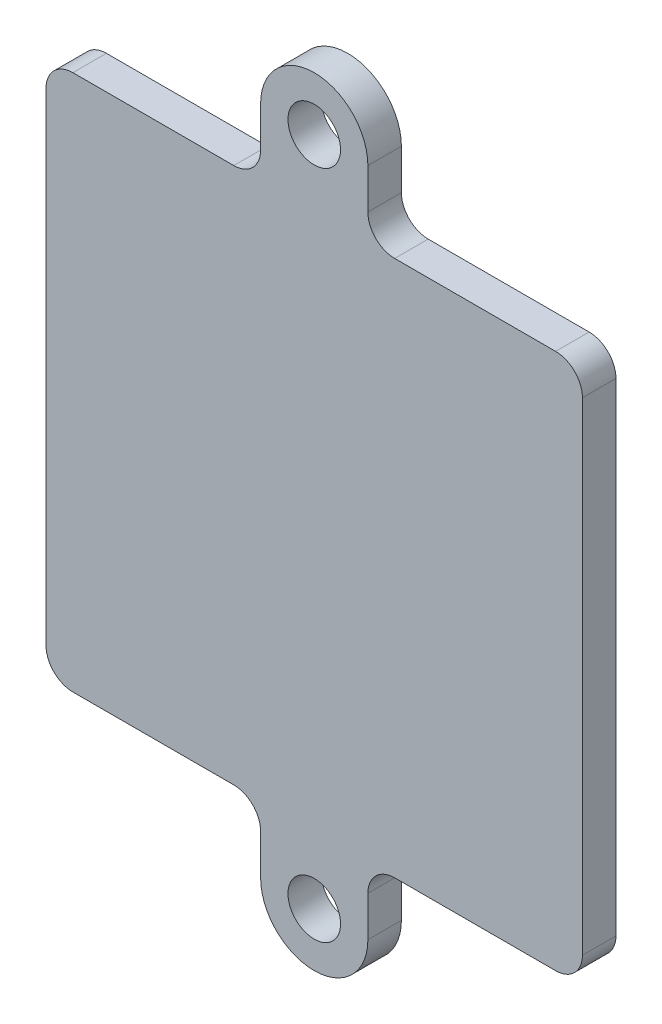
ISO-10303-21;
HEADER;
FILE_DESCRIPTION(('STEP AP214'),'2;1');
FILE_NAME('part.step','',(''),(''),'','','');
FILE_SCHEMA(('AUTOMOTIVE_DESIGN { 1 0 10303 214 1 1 1 1 }'));
ENDSEC;
DATA;
#1=APPLICATION_CONTEXT('core data for automotive mechanical design processes');
#2=APPLICATION_PROTOCOL_DEFINITION('international standard','automotive_design',2000,#1);
#3=PRODUCT_CONTEXT('',#1,'mechanical');
#4=PRODUCT('Part','Part','',(#3));
#5=PRODUCT_RELATED_PRODUCT_CATEGORY('part','',(#4));
#6=PRODUCT_DEFINITION_FORMATION('','',#4);
#7=PRODUCT_DEFINITION_CONTEXT('part definition',#1,'design');
#8=PRODUCT_DEFINITION('design','',#6,#7);
#9=PRODUCT_DEFINITION_SHAPE('','',#8);
#10=(LENGTH_UNIT() NAMED_UNIT(*) SI_UNIT(.MILLI.,.METRE.));
#11=(NAMED_UNIT(*) PLANE_ANGLE_UNIT() SI_UNIT($,.RADIAN.));
#12=(NAMED_UNIT(*) SI_UNIT($,.STERADIAN.) SOLID_ANGLE_UNIT());
#13=UNCERTAINTY_MEASURE_WITH_UNIT(LENGTH_MEASURE(1.E-05),#10,'distance_accuracy_value','');
#14=(GEOMETRIC_REPRESENTATION_CONTEXT(3) GLOBAL_UNCERTAINTY_ASSIGNED_CONTEXT((#13)) GLOBAL_UNIT_ASSIGNED_CONTEXT((#10,
#11,#12)) REPRESENTATION_CONTEXT('',''));
#15=CARTESIAN_POINT('',(0.,0.,0.));
#16=DIRECTION('',(0.,0.,1.));
#17=DIRECTION('',(1.,0.,0.));
#18=AXIS2_PLACEMENT_3D('',#15,#16,#17);
#19=CARTESIAN_POINT('',(-80.881847215181,46.1204293588608,3.175));
#20=DIRECTION('',(0.,0.,-1.));
#21=DIRECTION('',(-1.,0.,0.));
#22=AXIS2_PLACEMENT_3D('',#19,#20,#21);
#23=PLANE('',#22);
#24=DIRECTION('',(1.,0.,0.));
#25=VECTOR('',#24,1.);
#26=CARTESIAN_POINT('',(-55.481847215181,52.4704293588608,3.175));
#27=LINE('',#26,#25);
#28=CARTESIAN_POINT('',(-73.261847215181,52.4704293588608,3.175));
#29=VERTEX_POINT('',#28);
#30=CARTESIAN_POINT('',(-58.021847215181,52.4704293588608,3.175));
#31=VERTEX_POINT('',#30);
#32=EDGE_CURVE('E220',#29,#31,#27,.T.);
#33=ORIENTED_EDGE('',*,*,#32,.T.);
#34=CARTESIAN_POINT('',(-58.021847215181,55.0104293588608,3.175));
#35=DIRECTION('',(0.,0.,-1.));
#36=DIRECTION('',(-1.,0.,0.));
#37=AXIS2_PLACEMENT_3D('',#34,#35,#36);
#38=CIRCLE('',#37,2.54);
#39=CARTESIAN_POINT('',(-55.481847215181,55.0104293588608,3.175));
#40=VERTEX_POINT('',#39);
#41=EDGE_CURVE('E284',#31,#40,#38,.F.);
#42=ORIENTED_EDGE('',*,*,#41,.T.);
#43=DIRECTION('',(0.,1.,0.));
#44=VECTOR('',#43,1.);
#45=CARTESIAN_POINT('',(-55.481847215181,103.270429358861,3.175));
#46=LINE('',#45,#44);
#47=CARTESIAN_POINT('',(-55.481847215181,100.730429358861,3.175));
#48=VERTEX_POINT('',#47);
#49=EDGE_CURVE('E254',#40,#48,#46,.T.);
#50=ORIENTED_EDGE('',*,*,#49,.T.);
#51=CARTESIAN_POINT('',(-58.021847215181,100.730429358861,3.175));
#52=DIRECTION('',(0.,0.,-1.));
#53=DIRECTION('',(-1.,0.,0.));
#54=AXIS2_PLACEMENT_3D('',#51,#52,#53);
#55=CIRCLE('',#54,2.54);
#56=CARTESIAN_POINT('',(-58.021847215181,103.270429358861,3.175));
#57=VERTEX_POINT('',#56);
#58=EDGE_CURVE('E278',#48,#57,#55,.F.);
#59=ORIENTED_EDGE('',*,*,#58,.T.);
#60=DIRECTION('',(-1.,0.,0.));
#61=VECTOR('',#60,1.);
#62=CARTESIAN_POINT('',(-55.481847215181,103.270429358861,3.175));
#63=LINE('',#62,#61);
#64=CARTESIAN_POINT('',(-73.261847215181,103.270429358861,3.175));
#65=VERTEX_POINT('',#64);
#66=EDGE_CURVE('E186',#57,#65,#63,.T.);
#67=ORIENTED_EDGE('',*,*,#66,.T.);
#68=CARTESIAN_POINT('',(-73.261847215181,105.810429358861,3.175));
#69=DIRECTION('',(0.,0.,-1.));
#70=DIRECTION('',(-1.,0.,0.));
#71=AXIS2_PLACEMENT_3D('',#68,#69,#70);
#72=CIRCLE('',#71,2.54);
#73=CARTESIAN_POINT('',(-75.801847215181,105.810429358861,3.175));
#74=VERTEX_POINT('',#73);
#75=EDGE_CURVE('E11',#65,#74,#72,.T.);
#76=ORIENTED_EDGE('',*,*,#75,.T.);
#77=DIRECTION('',(0.,1.,0.));
#78=VECTOR('',#77,1.);
#79=CARTESIAN_POINT('',(-75.801847215181,103.270429358861,3.175));
#80=LINE('',#79,#78);
#81=CARTESIAN_POINT('',(-75.801847215181,109.620429358861,3.175));
#82=VERTEX_POINT('',#81);
#83=EDGE_CURVE('E173',#74,#82,#80,.T.);
#84=ORIENTED_EDGE('',*,*,#83,.T.);
#85=CARTESIAN_POINT('',(-80.881847215181,109.620429358861,3.175));
#86=DIRECTION('',(0.,0.,1.));
#87=DIRECTION('',(1.,0.,0.));
#88=AXIS2_PLACEMENT_3D('',#85,#86,#87);
#89=CIRCLE('',#88,5.07999999999999);
#90=CARTESIAN_POINT('',(-85.961847215181,109.620429358861,3.175));
#91=VERTEX_POINT('',#90);
#92=EDGE_CURVE('E179',#82,#91,#89,.T.);
#93=ORIENTED_EDGE('',*,*,#92,.T.);
#94=DIRECTION('',(0.,-1.,0.));
#95=VECTOR('',#94,1.);
#96=CARTESIAN_POINT('',(-85.961847215181,103.270429358861,3.175));
#97=LINE('',#96,#95);
#98=CARTESIAN_POINT('',(-85.961847215181,105.810429358861,3.175));
#99=VERTEX_POINT('',#98);
#100=EDGE_CURVE('E201',#91,#99,#97,.T.);
#101=ORIENTED_EDGE('',*,*,#100,.T.);
#102=CARTESIAN_POINT('',(-88.501847215181,105.810429358861,3.175));
#103=DIRECTION('',(0.,0.,-1.));
#104=DIRECTION('',(-1.,0.,0.));
#105=AXIS2_PLACEMENT_3D('',#102,#103,#104);
#106=CIRCLE('',#105,2.54);
#107=CARTESIAN_POINT('',(-88.501847215181,103.270429358861,3.175));
#108=VERTEX_POINT('',#107);
#109=EDGE_CURVE('E323',#99,#108,#106,.T.);
#110=ORIENTED_EDGE('',*,*,#109,.T.);
#111=DIRECTION('',(-1.,0.,0.));
#112=VECTOR('',#111,1.);
#113=CARTESIAN_POINT('',(-85.961847215181,103.270429358861,3.175));
#114=LINE('',#113,#112);
#115=CARTESIAN_POINT('',(-103.741847215181,103.270429358861,3.175));
#116=VERTEX_POINT('',#115);
#117=EDGE_CURVE('E203',#108,#116,#114,.T.);
#118=ORIENTED_EDGE('',*,*,#117,.T.);
#119=CARTESIAN_POINT('',(-103.741847215181,100.730429358861,3.175));
#120=DIRECTION('',(0.,0.,-1.));
#121=DIRECTION('',(-1.,0.,0.));
#122=AXIS2_PLACEMENT_3D('',#119,#120,#121);
#123=CIRCLE('',#122,2.54);
#124=CARTESIAN_POINT('',(-106.281847215181,100.730429358861,3.175));
#125=VERTEX_POINT('',#124);
#126=EDGE_CURVE('E280',#116,#125,#123,.F.);
#127=ORIENTED_EDGE('',*,*,#126,.T.);
#128=DIRECTION('',(0.,-1.,0.));
#129=VECTOR('',#128,1.);
#130=CARTESIAN_POINT('',(-106.281847215181,103.270429358861,3.175));
#131=LINE('',#130,#129);
#132=CARTESIAN_POINT('',(-106.281847215181,55.0104293588608,3.175));
#133=VERTEX_POINT('',#132);
#134=EDGE_CURVE('E209',#125,#133,#131,.T.);
#135=ORIENTED_EDGE('',*,*,#134,.T.);
#136=CARTESIAN_POINT('',(-103.741847215181,55.0104293588608,3.175));
#137=DIRECTION('',(0.,0.,-1.));
#138=DIRECTION('',(-1.,0.,0.));
#139=AXIS2_PLACEMENT_3D('',#136,#137,#138);
#140=CIRCLE('',#139,2.54);
#141=CARTESIAN_POINT('',(-103.741847215181,52.4704293588608,3.175));
#142=VERTEX_POINT('',#141);
#143=EDGE_CURVE('E282',#133,#142,#140,.F.);
#144=ORIENTED_EDGE('',*,*,#143,.T.);
#145=DIRECTION('',(1.,0.,0.));
#146=VECTOR('',#145,1.);
#147=CARTESIAN_POINT('',(-85.961847215181,52.4704293588608,3.175));
#148=LINE('',#147,#146);
#149=CARTESIAN_POINT('',(-88.501847215181,52.4704293588608,3.175));
#150=VERTEX_POINT('',#149);
#151=EDGE_CURVE('E212',#142,#150,#148,.T.);
#152=ORIENTED_EDGE('',*,*,#151,.T.);
#153=CARTESIAN_POINT('',(-88.501847215181,49.9304293588608,3.175));
#154=DIRECTION('',(0.,0.,-1.));
#155=DIRECTION('',(-1.,0.,0.));
#156=AXIS2_PLACEMENT_3D('',#153,#154,#155);
#157=CIRCLE('',#156,2.54);
#158=CARTESIAN_POINT('',(-85.961847215181,49.9304293588608,3.175));
#159=VERTEX_POINT('',#158);
#160=EDGE_CURVE('E59',#150,#159,#157,.T.);
#161=ORIENTED_EDGE('',*,*,#160,.T.);
#162=DIRECTION('',(0.,-1.,0.));
#163=VECTOR('',#162,1.);
#164=CARTESIAN_POINT('',(-85.961847215181,52.4704293588608,3.175));
#165=LINE('',#164,#163);
#166=CARTESIAN_POINT('',(-85.961847215181,46.1204293588608,3.175));
#167=VERTEX_POINT('',#166);
#168=EDGE_CURVE('E214',#159,#167,#165,.T.);
#169=ORIENTED_EDGE('',*,*,#168,.T.);
#170=CARTESIAN_POINT('',(-80.881847215181,46.1204293588608,3.175));
#171=DIRECTION('',(0.,0.,1.));
#172=DIRECTION('',(-1.,0.,0.));
#173=AXIS2_PLACEMENT_3D('',#170,#171,#172);
#174=CIRCLE('',#173,5.07999999999999);
#175=CARTESIAN_POINT('',(-75.801847215181,46.1204293588608,3.175));
#176=VERTEX_POINT('',#175);
#177=EDGE_CURVE('E216',#167,#176,#174,.T.);
#178=ORIENTED_EDGE('',*,*,#177,.T.);
#179=DIRECTION('',(0.,1.,0.));
#180=VECTOR('',#179,1.);
#181=CARTESIAN_POINT('',(-75.801847215181,52.4704293588608,3.175));
#182=LINE('',#181,#180);
#183=CARTESIAN_POINT('',(-75.801847215181,49.9304293588608,3.175));
#184=VERTEX_POINT('',#183);
#185=EDGE_CURVE('E218',#176,#184,#182,.T.);
#186=ORIENTED_EDGE('',*,*,#185,.T.);
#187=CARTESIAN_POINT('',(-73.261847215181,49.9304293588608,3.175));
#188=DIRECTION('',(0.,0.,-1.));
#189=DIRECTION('',(-1.,0.,0.));
#190=AXIS2_PLACEMENT_3D('',#187,#188,#189);
#191=CIRCLE('',#190,2.54);
#192=EDGE_CURVE('E316',#184,#29,#191,.T.);
#193=ORIENTED_EDGE('',*,*,#192,.T.);
#194=EDGE_LOOP('',(#33,#42,#50,#59,#67,#76,#84,#93,#101,#110,#118,#127,#135,#144,#152,#161,#169,
#178,#186,#193));
#195=FACE_BOUND('',#194,.T.);
#196=CARTESIAN_POINT('',(-80.881847215181,46.1204293588608,3.175));
#197=DIRECTION('',(0.,0.,1.));
#198=DIRECTION('',(1.,0.,0.));
#199=AXIS2_PLACEMENT_3D('',#196,#197,#198);
#200=CIRCLE('',#199,2.4892);
#201=CARTESIAN_POINT('',(-78.392647215181,46.1204293588608,3.175));
#202=VERTEX_POINT('',#201);
#203=EDGE_CURVE('E227',#202,#202,#200,.T.);
#204=ORIENTED_EDGE('',*,*,#203,.F.);
#205=EDGE_LOOP('',(#204));
#206=FACE_BOUND('',#205,.T.);
#207=CARTESIAN_POINT('',(-80.881847215181,109.620429358861,3.175));
#208=DIRECTION('',(0.,0.,1.));
#209=DIRECTION('',(1.,0.,0.));
#210=AXIS2_PLACEMENT_3D('',#207,#208,#209);
#211=CIRCLE('',#210,2.4892);
#212=CARTESIAN_POINT('',(-78.392647215181,109.620429358861,3.175));
#213=VERTEX_POINT('',#212);
#214=EDGE_CURVE('E458',#213,#213,#211,.T.);
#215=ORIENTED_EDGE('',*,*,#214,.F.);
#216=EDGE_LOOP('',(#215));
#217=FACE_BOUND('',#216,.T.);
#218=ADVANCED_FACE('F36',(#195,#206,#217),#23,.F.);
#219=CARTESIAN_POINT('',(-80.881847215181,46.1204293588608,0.));
#220=DIRECTION('',(0.,0.,-1.));
#221=DIRECTION('',(-1.,0.,0.));
#222=AXIS2_PLACEMENT_3D('',#219,#220,#221);
#223=PLANE('',#222);
#224=CARTESIAN_POINT('',(-80.881847215181,46.1204293588608,0.));
#225=DIRECTION('',(0.,0.,1.));
#226=DIRECTION('',(1.,0.,0.));
#227=AXIS2_PLACEMENT_3D('',#224,#225,#226);
#228=CIRCLE('',#227,2.4892);
#229=CARTESIAN_POINT('',(-78.392647215181,46.1204293588608,0.));
#230=VERTEX_POINT('',#229);
#231=EDGE_CURVE('E455',#230,#230,#228,.T.);
#232=ORIENTED_EDGE('',*,*,#231,.T.);
#233=EDGE_LOOP('',(#232));
#234=FACE_BOUND('',#233,.T.);
#235=DIRECTION('',(0.,1.,0.));
#236=VECTOR('',#235,1.);
#237=CARTESIAN_POINT('',(-55.481847215181,103.270429358861,0.));
#238=LINE('',#237,#236);
#239=CARTESIAN_POINT('',(-55.481847215181,55.0104293588608,0.));
#240=VERTEX_POINT('',#239);
#241=CARTESIAN_POINT('',(-55.481847215181,100.730429358861,0.));
#242=VERTEX_POINT('',#241);
#243=EDGE_CURVE('E223',#240,#242,#238,.T.);
#244=ORIENTED_EDGE('',*,*,#243,.F.);
#245=CARTESIAN_POINT('',(-58.021847215181,55.0104293588608,0.));
#246=DIRECTION('',(0.,0.,-1.));
#247=DIRECTION('',(-1.,0.,0.));
#248=AXIS2_PLACEMENT_3D('',#245,#246,#247);
#249=CIRCLE('',#248,2.54);
#250=CARTESIAN_POINT('',(-58.021847215181,52.4704293588608,0.));
#251=VERTEX_POINT('',#250);
#252=EDGE_CURVE('E271',#240,#251,#249,.T.);
#253=ORIENTED_EDGE('',*,*,#252,.T.);
#254=DIRECTION('',(1.,0.,0.));
#255=VECTOR('',#254,1.);
#256=CARTESIAN_POINT('',(-55.481847215181,52.4704293588608,0.));
#257=LINE('',#256,#255);
#258=CARTESIAN_POINT('',(-73.261847215181,52.4704293588608,0.));
#259=VERTEX_POINT('',#258);
#260=EDGE_CURVE('E251',#259,#251,#257,.T.);
#261=ORIENTED_EDGE('',*,*,#260,.F.);
#262=CARTESIAN_POINT('',(-73.261847215181,49.9304293588608,0.));
#263=DIRECTION('',(0.,0.,-1.));
#264=DIRECTION('',(-1.,0.,0.));
#265=AXIS2_PLACEMENT_3D('',#262,#263,#264);
#266=CIRCLE('',#265,2.54);
#267=CARTESIAN_POINT('',(-75.801847215181,49.9304293588608,0.));
#268=VERTEX_POINT('',#267);
#269=EDGE_CURVE('E314',#259,#268,#266,.F.);
#270=ORIENTED_EDGE('',*,*,#269,.T.);
#271=DIRECTION('',(0.,1.,0.));
#272=VECTOR('',#271,1.);
#273=CARTESIAN_POINT('',(-75.801847215181,52.4704293588608,0.));
#274=LINE('',#273,#272);
#275=CARTESIAN_POINT('',(-75.801847215181,46.1204293588608,0.));
#276=VERTEX_POINT('',#275);
#277=EDGE_CURVE('E249',#276,#268,#274,.T.);
#278=ORIENTED_EDGE('',*,*,#277,.F.);
#279=CARTESIAN_POINT('',(-80.881847215181,46.1204293588608,0.));
#280=DIRECTION('',(0.,0.,1.));
#281=DIRECTION('',(-1.,0.,0.));
#282=AXIS2_PLACEMENT_3D('',#279,#280,#281);
#283=CIRCLE('',#282,5.07999999999999);
#284=CARTESIAN_POINT('',(-85.961847215181,46.1204293588608,0.));
#285=VERTEX_POINT('',#284);
#286=EDGE_CURVE('E247',#285,#276,#283,.T.);
#287=ORIENTED_EDGE('',*,*,#286,.F.);
#288=DIRECTION('',(0.,-1.,0.));
#289=VECTOR('',#288,1.);
#290=CARTESIAN_POINT('',(-85.961847215181,52.4704293588608,0.));
#291=LINE('',#290,#289);
#292=CARTESIAN_POINT('',(-85.961847215181,49.9304293588608,0.));
#293=VERTEX_POINT('',#292);
#294=EDGE_CURVE('E245',#293,#285,#291,.T.);
#295=ORIENTED_EDGE('',*,*,#294,.F.);
#296=CARTESIAN_POINT('',(-88.501847215181,49.9304293588608,0.));
#297=DIRECTION('',(0.,0.,-1.));
#298=DIRECTION('',(-1.,0.,0.));
#299=AXIS2_PLACEMENT_3D('',#296,#297,#298);
#300=CIRCLE('',#299,2.54);
#301=CARTESIAN_POINT('',(-88.501847215181,52.4704293588608,0.));
#302=VERTEX_POINT('',#301);
#303=EDGE_CURVE('E318',#293,#302,#300,.F.);
#304=ORIENTED_EDGE('',*,*,#303,.T.);
#305=DIRECTION('',(1.,0.,0.));
#306=VECTOR('',#305,1.);
#307=CARTESIAN_POINT('',(-85.961847215181,52.4704293588608,0.));
#308=LINE('',#307,#306);
#309=CARTESIAN_POINT('',(-103.741847215181,52.4704293588608,0.));
#310=VERTEX_POINT('',#309);
#311=EDGE_CURVE('E242',#310,#302,#308,.T.);
#312=ORIENTED_EDGE('',*,*,#311,.F.);
#313=CARTESIAN_POINT('',(-103.741847215181,55.0104293588608,0.));
#314=DIRECTION('',(0.,0.,-1.));
#315=DIRECTION('',(-1.,0.,0.));
#316=AXIS2_PLACEMENT_3D('',#313,#314,#315);
#317=CIRCLE('',#316,2.54);
#318=CARTESIAN_POINT('',(-106.281847215181,55.0104293588608,0.));
#319=VERTEX_POINT('',#318);
#320=EDGE_CURVE('E269',#310,#319,#317,.T.);
#321=ORIENTED_EDGE('',*,*,#320,.T.);
#322=DIRECTION('',(0.,-1.,0.));
#323=VECTOR('',#322,1.);
#324=CARTESIAN_POINT('',(-106.281847215181,103.270429358861,0.));
#325=LINE('',#324,#323);
#326=CARTESIAN_POINT('',(-106.281847215181,100.730429358861,0.));
#327=VERTEX_POINT('',#326);
#328=EDGE_CURVE('E239',#327,#319,#325,.T.);
#329=ORIENTED_EDGE('',*,*,#328,.F.);
#330=CARTESIAN_POINT('',(-103.741847215181,100.730429358861,0.));
#331=DIRECTION('',(0.,0.,-1.));
#332=DIRECTION('',(-1.,0.,0.));
#333=AXIS2_PLACEMENT_3D('',#330,#331,#332);
#334=CIRCLE('',#333,2.54);
#335=CARTESIAN_POINT('',(-103.741847215181,103.270429358861,0.));
#336=VERTEX_POINT('',#335);
#337=EDGE_CURVE('E267',#327,#336,#334,.T.);
#338=ORIENTED_EDGE('',*,*,#337,.T.);
#339=DIRECTION('',(-1.,0.,0.));
#340=VECTOR('',#339,1.);
#341=CARTESIAN_POINT('',(-85.961847215181,103.270429358861,0.));
#342=LINE('',#341,#340);
#343=CARTESIAN_POINT('',(-88.501847215181,103.270429358861,0.));
#344=VERTEX_POINT('',#343);
#345=EDGE_CURVE('E236',#344,#336,#342,.T.);
#346=ORIENTED_EDGE('',*,*,#345,.F.);
#347=CARTESIAN_POINT('',(-88.501847215181,105.810429358861,0.));
#348=DIRECTION('',(0.,0.,-1.));
#349=DIRECTION('',(-1.,0.,0.));
#350=AXIS2_PLACEMENT_3D('',#347,#348,#349);
#351=CIRCLE('',#350,2.54);
#352=CARTESIAN_POINT('',(-85.961847215181,105.810429358861,0.));
#353=VERTEX_POINT('',#352);
#354=EDGE_CURVE('E321',#344,#353,#351,.F.);
#355=ORIENTED_EDGE('',*,*,#354,.T.);
#356=DIRECTION('',(0.,-1.,0.));
#357=VECTOR('',#356,1.);
#358=CARTESIAN_POINT('',(-85.961847215181,103.270429358861,0.));
#359=LINE('',#358,#357);
#360=CARTESIAN_POINT('',(-85.961847215181,109.620429358861,0.));
#361=VERTEX_POINT('',#360);
#362=EDGE_CURVE('E233',#361,#353,#359,.T.);
#363=ORIENTED_EDGE('',*,*,#362,.F.);
#364=CARTESIAN_POINT('',(-80.881847215181,109.620429358861,0.));
#365=DIRECTION('',(0.,0.,1.));
#366=DIRECTION('',(1.,0.,0.));
#367=AXIS2_PLACEMENT_3D('',#364,#365,#366);
#368=CIRCLE('',#367,5.07999999999999);
#369=CARTESIAN_POINT('',(-75.801847215181,109.620429358861,0.));
#370=VERTEX_POINT('',#369);
#371=EDGE_CURVE('E231',#370,#361,#368,.T.);
#372=ORIENTED_EDGE('',*,*,#371,.F.);
#373=DIRECTION('',(0.,1.,0.));
#374=VECTOR('',#373,1.);
#375=CARTESIAN_POINT('',(-75.801847215181,103.270429358861,0.));
#376=LINE('',#375,#374);
#377=CARTESIAN_POINT('',(-75.801847215181,105.810429358861,0.));
#378=VERTEX_POINT('',#377);
#379=EDGE_CURVE('E192',#378,#370,#376,.T.);
#380=ORIENTED_EDGE('',*,*,#379,.F.);
#381=CARTESIAN_POINT('',(-73.261847215181,105.810429358861,0.));
#382=DIRECTION('',(0.,0.,-1.));
#383=DIRECTION('',(-1.,0.,0.));
#384=AXIS2_PLACEMENT_3D('',#381,#382,#383);
#385=CIRCLE('',#384,2.54);
#386=CARTESIAN_POINT('',(-73.261847215181,103.270429358861,0.));
#387=VERTEX_POINT('',#386);
#388=EDGE_CURVE('E44',#378,#387,#385,.F.);
#389=ORIENTED_EDGE('',*,*,#388,.T.);
#390=DIRECTION('',(-1.,0.,0.));
#391=VECTOR('',#390,1.);
#392=CARTESIAN_POINT('',(-55.481847215181,103.270429358861,0.));
#393=LINE('',#392,#391);
#394=CARTESIAN_POINT('',(-58.021847215181,103.270429358861,0.));
#395=VERTEX_POINT('',#394);
#396=EDGE_CURVE('E226',#395,#387,#393,.T.);
#397=ORIENTED_EDGE('',*,*,#396,.F.);
#398=CARTESIAN_POINT('',(-58.021847215181,100.730429358861,0.));
#399=DIRECTION('',(0.,0.,-1.));
#400=DIRECTION('',(-1.,0.,0.));
#401=AXIS2_PLACEMENT_3D('',#398,#399,#400);
#402=CIRCLE('',#401,2.54);
#403=EDGE_CURVE('E265',#395,#242,#402,.T.);
#404=ORIENTED_EDGE('',*,*,#403,.T.);
#405=EDGE_LOOP('',(#244,#253,#261,#270,#278,#287,#295,#304,#312,#321,#329,#338,#346,#355,#363,
#372,#380,#389,#397,#404));
#406=FACE_BOUND('',#405,.T.);
#407=CARTESIAN_POINT('',(-80.881847215181,109.620429358861,0.));
#408=DIRECTION('',(0.,0.,1.));
#409=DIRECTION('',(1.,0.,0.));
#410=AXIS2_PLACEMENT_3D('',#407,#408,#409);
#411=CIRCLE('',#410,2.4892);
#412=CARTESIAN_POINT('',(-78.392647215181,109.620429358861,0.));
#413=VERTEX_POINT('',#412);
#414=EDGE_CURVE('E461',#413,#413,#411,.T.);
#415=ORIENTED_EDGE('',*,*,#414,.T.);
#416=EDGE_LOOP('',(#415));
#417=FACE_BOUND('',#416,.T.);
#418=ADVANCED_FACE('F327',(#234,#406,#417),#223,.T.);
#419=CARTESIAN_POINT('',(-55.481847215181,103.270429358861,3.175));
#420=DIRECTION('',(-1.,0.,0.));
#421=DIRECTION('',(0.,0.,1.));
#422=AXIS2_PLACEMENT_3D('',#419,#420,#421);
#423=PLANE('',#422);
#424=ORIENTED_EDGE('',*,*,#49,.F.);
#425=DIRECTION('',(0.,0.,-1.));
#426=VECTOR('',#425,1.);
#427=CARTESIAN_POINT('',(-55.481847215181,55.0104293588608,3.175));
#428=LINE('',#427,#426);
#429=EDGE_CURVE('E262',#40,#240,#428,.T.);
#430=ORIENTED_EDGE('',*,*,#429,.T.);
#431=ORIENTED_EDGE('',*,*,#243,.T.);
#432=DIRECTION('',(0.,0.,-1.));
#433=VECTOR('',#432,1.);
#434=CARTESIAN_POINT('',(-55.481847215181,100.730429358861,3.175));
#435=LINE('',#434,#433);
#436=EDGE_CURVE('E195',#242,#48,#435,.F.);
#437=ORIENTED_EDGE('',*,*,#436,.T.);
#438=EDGE_LOOP('',(#424,#430,#431,#437));
#439=FACE_BOUND('',#438,.T.);
#440=ADVANCED_FACE('F347',(#439),#423,.F.);
#441=CARTESIAN_POINT('',(-55.481847215181,103.270429358861,3.175));
#442=DIRECTION('',(0.,-1.,0.));
#443=DIRECTION('',(1.,0.,0.));
#444=AXIS2_PLACEMENT_3D('',#441,#442,#443);
#445=PLANE('',#444);
#446=ORIENTED_EDGE('',*,*,#66,.F.);
#447=DIRECTION('',(0.,0.,-1.));
#448=VECTOR('',#447,1.);
#449=CARTESIAN_POINT('',(-58.021847215181,103.270429358861,3.175));
#450=LINE('',#449,#448);
#451=EDGE_CURVE('E309',#57,#395,#450,.T.);
#452=ORIENTED_EDGE('',*,*,#451,.T.);
#453=ORIENTED_EDGE('',*,*,#396,.T.);
#454=DIRECTION('',(0.,0.,-1.));
#455=VECTOR('',#454,1.);
#456=CARTESIAN_POINT('',(-73.261847215181,103.270429358861,3.175));
#457=LINE('',#456,#455);
#458=EDGE_CURVE('E307',#387,#65,#457,.F.);
#459=ORIENTED_EDGE('',*,*,#458,.T.);
#460=EDGE_LOOP('',(#446,#452,#453,#459));
#461=FACE_BOUND('',#460,.T.);
#462=ADVANCED_FACE('F333',(#461),#445,.F.);
#463=CARTESIAN_POINT('',(-75.801847215181,103.270429358861,3.175));
#464=DIRECTION('',(-1.,0.,0.));
#465=DIRECTION('',(0.,0.,1.));
#466=AXIS2_PLACEMENT_3D('',#463,#464,#465);
#467=PLANE('',#466);
#468=ORIENTED_EDGE('',*,*,#83,.F.);
#469=DIRECTION('',(0.,0.,-1.));
#470=VECTOR('',#469,1.);
#471=CARTESIAN_POINT('',(-75.801847215181,105.810429358861,0.));
#472=LINE('',#471,#470);
#473=EDGE_CURVE('E312',#74,#378,#472,.T.);
#474=ORIENTED_EDGE('',*,*,#473,.T.);
#475=ORIENTED_EDGE('',*,*,#379,.T.);
#476=DIRECTION('',(0.,0.,-1.));
#477=VECTOR('',#476,1.);
#478=CARTESIAN_POINT('',(-75.801847215181,109.620429358861,3.175));
#479=LINE('',#478,#477);
#480=EDGE_CURVE('E189',#82,#370,#479,.T.);
#481=ORIENTED_EDGE('',*,*,#480,.F.);
#482=EDGE_LOOP('',(#468,#474,#475,#481));
#483=FACE_BOUND('',#482,.T.);
#484=ADVANCED_FACE('F190',(#483),#467,.F.);
#485=CARTESIAN_POINT('',(-80.881847215181,109.620429358861,3.175));
#486=DIRECTION('',(0.,0.,-1.));
#487=DIRECTION('',(-1.,0.,0.));
#488=AXIS2_PLACEMENT_3D('',#485,#486,#487);
#489=CYLINDRICAL_SURFACE('',#488,5.07999999999999);
#490=ORIENTED_EDGE('',*,*,#371,.T.);
#491=DIRECTION('',(0.,0.,-1.));
#492=VECTOR('',#491,1.);
#493=CARTESIAN_POINT('',(-85.961847215181,109.620429358861,3.175));
#494=LINE('',#493,#492);
#495=EDGE_CURVE('E196',#91,#361,#494,.T.);
#496=ORIENTED_EDGE('',*,*,#495,.F.);
#497=ORIENTED_EDGE('',*,*,#92,.F.);
#498=ORIENTED_EDGE('',*,*,#480,.T.);
#499=EDGE_LOOP('',(#490,#496,#497,#498));
#500=FACE_BOUND('',#499,.T.);
#501=ADVANCED_FACE('F198',(#500),#489,.T.);
#502=CARTESIAN_POINT('',(-85.961847215181,103.270429358861,3.175));
#503=DIRECTION('',(1.,0.,0.));
#504=DIRECTION('',(0.,1.,0.));
#505=AXIS2_PLACEMENT_3D('',#502,#503,#504);
#506=PLANE('',#505);
#507=ORIENTED_EDGE('',*,*,#362,.T.);
#508=DIRECTION('',(0.,0.,-1.));
#509=VECTOR('',#508,1.);
#510=CARTESIAN_POINT('',(-85.961847215181,105.810429358861,3.175));
#511=LINE('',#510,#509);
#512=EDGE_CURVE('E305',#353,#99,#511,.F.);
#513=ORIENTED_EDGE('',*,*,#512,.T.);
#514=ORIENTED_EDGE('',*,*,#100,.F.);
#515=ORIENTED_EDGE('',*,*,#495,.T.);
#516=EDGE_LOOP('',(#507,#513,#514,#515));
#517=FACE_BOUND('',#516,.T.);
#518=ADVANCED_FACE('F380',(#517),#506,.F.);
#519=CARTESIAN_POINT('',(-85.961847215181,103.270429358861,3.175));
#520=DIRECTION('',(0.,-1.,0.));
#521=DIRECTION('',(1.,0.,0.));
#522=AXIS2_PLACEMENT_3D('',#519,#520,#521);
#523=PLANE('',#522);
#524=ORIENTED_EDGE('',*,*,#345,.T.);
#525=DIRECTION('',(0.,0.,-1.));
#526=VECTOR('',#525,1.);
#527=CARTESIAN_POINT('',(-103.741847215181,103.270429358861,3.175));
#528=LINE('',#527,#526);
#529=EDGE_CURVE('E303',#336,#116,#528,.F.);
#530=ORIENTED_EDGE('',*,*,#529,.T.);
#531=ORIENTED_EDGE('',*,*,#117,.F.);
#532=DIRECTION('',(0.,0.,-1.));
#533=VECTOR('',#532,1.);
#534=CARTESIAN_POINT('',(-88.501847215181,103.270429358861,0.));
#535=LINE('',#534,#533);
#536=EDGE_CURVE('E300',#108,#344,#535,.T.);
#537=ORIENTED_EDGE('',*,*,#536,.T.);
#538=EDGE_LOOP('',(#524,#530,#531,#537));
#539=FACE_BOUND('',#538,.T.);
#540=ADVANCED_FACE('F376',(#539),#523,.F.);
#541=CARTESIAN_POINT('',(-106.281847215181,103.270429358861,3.175));
#542=DIRECTION('',(1.,0.,0.));
#543=DIRECTION('',(0.,0.,-1.));
#544=AXIS2_PLACEMENT_3D('',#541,#542,#543);
#545=PLANE('',#544);
#546=ORIENTED_EDGE('',*,*,#328,.T.);
#547=DIRECTION('',(0.,0.,-1.));
#548=VECTOR('',#547,1.);
#549=CARTESIAN_POINT('',(-106.281847215181,55.0104293588608,3.175));
#550=LINE('',#549,#548);
#551=EDGE_CURVE('E298',#319,#133,#550,.F.);
#552=ORIENTED_EDGE('',*,*,#551,.T.);
#553=ORIENTED_EDGE('',*,*,#134,.F.);
#554=DIRECTION('',(0.,0.,-1.));
#555=VECTOR('',#554,1.);
#556=CARTESIAN_POINT('',(-106.281847215181,100.730429358861,3.175));
#557=LINE('',#556,#555);
#558=EDGE_CURVE('E295',#125,#327,#557,.T.);
#559=ORIENTED_EDGE('',*,*,#558,.T.);
#560=EDGE_LOOP('',(#546,#552,#553,#559));
#561=FACE_BOUND('',#560,.T.);
#562=ADVANCED_FACE('F372',(#561),#545,.F.);
#563=CARTESIAN_POINT('',(-85.961847215181,52.4704293588608,3.175));
#564=DIRECTION('',(0.,1.,0.));
#565=DIRECTION('',(-1.,0.,0.));
#566=AXIS2_PLACEMENT_3D('',#563,#564,#565);
#567=PLANE('',#566);
#568=ORIENTED_EDGE('',*,*,#311,.T.);
#569=DIRECTION('',(0.,0.,-1.));
#570=VECTOR('',#569,1.);
#571=CARTESIAN_POINT('',(-88.501847215181,52.4704293588608,3.175));
#572=LINE('',#571,#570);
#573=EDGE_CURVE('E293',#302,#150,#572,.F.);
#574=ORIENTED_EDGE('',*,*,#573,.T.);
#575=ORIENTED_EDGE('',*,*,#151,.F.);
#576=DIRECTION('',(0.,0.,-1.));
#577=VECTOR('',#576,1.);
#578=CARTESIAN_POINT('',(-103.741847215181,52.4704293588608,3.175));
#579=LINE('',#578,#577);
#580=EDGE_CURVE('E290',#142,#310,#579,.T.);
#581=ORIENTED_EDGE('',*,*,#580,.T.);
#582=EDGE_LOOP('',(#568,#574,#575,#581));
#583=FACE_BOUND('',#582,.T.);
#584=ADVANCED_FACE('F368',(#583),#567,.F.);
#585=CARTESIAN_POINT('',(-85.961847215181,52.4704293588608,3.175));
#586=DIRECTION('',(1.,0.,0.));
#587=DIRECTION('',(0.,1.,0.));
#588=AXIS2_PLACEMENT_3D('',#585,#586,#587);
#589=PLANE('',#588);
#590=ORIENTED_EDGE('',*,*,#168,.F.);
#591=DIRECTION('',(0.,0.,-1.));
#592=VECTOR('',#591,1.);
#593=CARTESIAN_POINT('',(-85.961847215181,49.9304293588608,0.));
#594=LINE('',#593,#592);
#595=EDGE_CURVE('E287',#159,#293,#594,.T.);
#596=ORIENTED_EDGE('',*,*,#595,.T.);
#597=ORIENTED_EDGE('',*,*,#294,.T.);
#598=DIRECTION('',(0.,0.,-1.));
#599=VECTOR('',#598,1.);
#600=CARTESIAN_POINT('',(-85.961847215181,46.1204293588608,3.175));
#601=LINE('',#600,#599);
#602=EDGE_CURVE('E257',#167,#285,#601,.T.);
#603=ORIENTED_EDGE('',*,*,#602,.F.);
#604=EDGE_LOOP('',(#590,#596,#597,#603));
#605=FACE_BOUND('',#604,.T.);
#606=ADVANCED_FACE('F364',(#605),#589,.F.);
#607=CARTESIAN_POINT('',(-80.881847215181,46.1204293588608,3.175));
#608=DIRECTION('',(0.,0.,-1.));
#609=DIRECTION('',(-1.,0.,0.));
#610=AXIS2_PLACEMENT_3D('',#607,#608,#609);
#611=CYLINDRICAL_SURFACE('',#610,5.07999999999999);
#612=ORIENTED_EDGE('',*,*,#286,.T.);
#613=DIRECTION('',(0.,0.,-1.));
#614=VECTOR('',#613,1.);
#615=CARTESIAN_POINT('',(-75.801847215181,46.1204293588608,3.175));
#616=LINE('',#615,#614);
#617=EDGE_CURVE('E222',#176,#276,#616,.T.);
#618=ORIENTED_EDGE('',*,*,#617,.F.);
#619=ORIENTED_EDGE('',*,*,#177,.F.);
#620=ORIENTED_EDGE('',*,*,#602,.T.);
#621=EDGE_LOOP('',(#612,#618,#619,#620));
#622=FACE_BOUND('',#621,.T.);
#623=ADVANCED_FACE('F361',(#622),#611,.T.);
#624=CARTESIAN_POINT('',(-75.801847215181,52.4704293588608,3.175));
#625=DIRECTION('',(-1.,0.,0.));
#626=DIRECTION('',(0.,0.,1.));
#627=AXIS2_PLACEMENT_3D('',#624,#625,#626);
#628=PLANE('',#627);
#629=ORIENTED_EDGE('',*,*,#277,.T.);
#630=DIRECTION('',(0.,0.,-1.));
#631=VECTOR('',#630,1.);
#632=CARTESIAN_POINT('',(-75.801847215181,49.9304293588608,3.175));
#633=LINE('',#632,#631);
#634=EDGE_CURVE('E51',#268,#184,#633,.F.);
#635=ORIENTED_EDGE('',*,*,#634,.T.);
#636=ORIENTED_EDGE('',*,*,#185,.F.);
#637=ORIENTED_EDGE('',*,*,#617,.T.);
#638=EDGE_LOOP('',(#629,#635,#636,#637));
#639=FACE_BOUND('',#638,.T.);
#640=ADVANCED_FACE('F357',(#639),#628,.F.);
#641=CARTESIAN_POINT('',(-55.481847215181,52.4704293588608,3.175));
#642=DIRECTION('',(0.,1.,0.));
#643=DIRECTION('',(-1.,0.,0.));
#644=AXIS2_PLACEMENT_3D('',#641,#642,#643);
#645=PLANE('',#644);
#646=ORIENTED_EDGE('',*,*,#260,.T.);
#647=DIRECTION('',(0.,0.,-1.));
#648=VECTOR('',#647,1.);
#649=CARTESIAN_POINT('',(-58.021847215181,52.4704293588608,3.175));
#650=LINE('',#649,#648);
#651=EDGE_CURVE('E276',#251,#31,#650,.F.);
#652=ORIENTED_EDGE('',*,*,#651,.T.);
#653=ORIENTED_EDGE('',*,*,#32,.F.);
#654=DIRECTION('',(0.,0.,-1.));
#655=VECTOR('',#654,1.);
#656=CARTESIAN_POINT('',(-73.261847215181,52.4704293588608,0.));
#657=LINE('',#656,#655);
#658=EDGE_CURVE('E273',#29,#259,#657,.T.);
#659=ORIENTED_EDGE('',*,*,#658,.T.);
#660=EDGE_LOOP('',(#646,#652,#653,#659));
#661=FACE_BOUND('',#660,.T.);
#662=ADVANCED_FACE('F354',(#661),#645,.F.);
#663=CARTESIAN_POINT('',(-80.881847215181,46.1204293588608,3.175));
#664=DIRECTION('',(0.,0.,-1.));
#665=DIRECTION('',(-1.,0.,0.));
#666=AXIS2_PLACEMENT_3D('',#663,#664,#665);
#667=CYLINDRICAL_SURFACE('',#666,2.4892);
#668=ORIENTED_EDGE('',*,*,#203,.T.);
#669=EDGE_LOOP('',(#668));
#670=FACE_BOUND('',#669,.T.);
#671=ORIENTED_EDGE('',*,*,#231,.F.);
#672=EDGE_LOOP('',(#671));
#673=FACE_BOUND('',#672,.T.);
#674=ADVANCED_FACE('F351',(#670,#673),#667,.F.);
#675=CARTESIAN_POINT('',(-80.881847215181,109.620429358861,3.175));
#676=DIRECTION('',(0.,0.,-1.));
#677=DIRECTION('',(-1.,0.,0.));
#678=AXIS2_PLACEMENT_3D('',#675,#676,#677);
#679=CYLINDRICAL_SURFACE('',#678,2.4892);
#680=ORIENTED_EDGE('',*,*,#214,.T.);
#681=EDGE_LOOP('',(#680));
#682=FACE_BOUND('',#681,.T.);
#683=ORIENTED_EDGE('',*,*,#414,.F.);
#684=EDGE_LOOP('',(#683));
#685=FACE_BOUND('',#684,.T.);
#686=ADVANCED_FACE('F398',(#682,#685),#679,.F.);
#687=CARTESIAN_POINT('',(-58.021847215181,55.0104293588608,3.175));
#688=DIRECTION('',(0.,0.,-1.));
#689=DIRECTION('',(-1.,0.,0.));
#690=AXIS2_PLACEMENT_3D('',#687,#688,#689);
#691=CYLINDRICAL_SURFACE('',#690,2.54);
#692=ORIENTED_EDGE('',*,*,#41,.F.);
#693=ORIENTED_EDGE('',*,*,#651,.F.);
#694=ORIENTED_EDGE('',*,*,#252,.F.);
#695=ORIENTED_EDGE('',*,*,#429,.F.);
#696=EDGE_LOOP('',(#692,#693,#694,#695));
#697=FACE_BOUND('',#696,.T.);
#698=ADVANCED_FACE('F394',(#697),#691,.T.);
#699=CARTESIAN_POINT('',(-73.261847215181,49.9304293588608,3.175));
#700=DIRECTION('',(0.,0.,1.));
#701=DIRECTION('',(1.,0.,0.));
#702=AXIS2_PLACEMENT_3D('',#699,#700,#701);
#703=CYLINDRICAL_SURFACE('',#702,2.54);
#704=ORIENTED_EDGE('',*,*,#192,.F.);
#705=ORIENTED_EDGE('',*,*,#634,.F.);
#706=ORIENTED_EDGE('',*,*,#269,.F.);
#707=ORIENTED_EDGE('',*,*,#658,.F.);
#708=EDGE_LOOP('',(#704,#705,#706,#707));
#709=FACE_BOUND('',#708,.T.);
#710=ADVANCED_FACE('F397',(#709),#703,.F.);
#711=CARTESIAN_POINT('',(-88.501847215181,49.9304293588608,3.175));
#712=DIRECTION('',(0.,0.,1.));
#713=DIRECTION('',(1.,0.,0.));
#714=AXIS2_PLACEMENT_3D('',#711,#712,#713);
#715=CYLINDRICAL_SURFACE('',#714,2.54);
#716=ORIENTED_EDGE('',*,*,#160,.F.);
#717=ORIENTED_EDGE('',*,*,#573,.F.);
#718=ORIENTED_EDGE('',*,*,#303,.F.);
#719=ORIENTED_EDGE('',*,*,#595,.F.);
#720=EDGE_LOOP('',(#716,#717,#718,#719));
#721=FACE_BOUND('',#720,.T.);
#722=ADVANCED_FACE('F402',(#721),#715,.F.);
#723=CARTESIAN_POINT('',(-103.741847215181,55.0104293588608,3.175));
#724=DIRECTION('',(0.,0.,-1.));
#725=DIRECTION('',(-1.,0.,0.));
#726=AXIS2_PLACEMENT_3D('',#723,#724,#725);
#727=CYLINDRICAL_SURFACE('',#726,2.54);
#728=ORIENTED_EDGE('',*,*,#143,.F.);
#729=ORIENTED_EDGE('',*,*,#551,.F.);
#730=ORIENTED_EDGE('',*,*,#320,.F.);
#731=ORIENTED_EDGE('',*,*,#580,.F.);
#732=EDGE_LOOP('',(#728,#729,#730,#731));
#733=FACE_BOUND('',#732,.T.);
#734=ADVANCED_FACE('F406',(#733),#727,.T.);
#735=CARTESIAN_POINT('',(-103.741847215181,100.730429358861,3.175));
#736=DIRECTION('',(0.,0.,-1.));
#737=DIRECTION('',(-1.,0.,0.));
#738=AXIS2_PLACEMENT_3D('',#735,#736,#737);
#739=CYLINDRICAL_SURFACE('',#738,2.54);
#740=ORIENTED_EDGE('',*,*,#126,.F.);
#741=ORIENTED_EDGE('',*,*,#529,.F.);
#742=ORIENTED_EDGE('',*,*,#337,.F.);
#743=ORIENTED_EDGE('',*,*,#558,.F.);
#744=EDGE_LOOP('',(#740,#741,#742,#743));
#745=FACE_BOUND('',#744,.T.);
#746=ADVANCED_FACE('F410',(#745),#739,.T.);
#747=CARTESIAN_POINT('',(-88.501847215181,105.810429358861,3.175));
#748=DIRECTION('',(0.,0.,1.));
#749=DIRECTION('',(1.,0.,0.));
#750=AXIS2_PLACEMENT_3D('',#747,#748,#749);
#751=CYLINDRICAL_SURFACE('',#750,2.54);
#752=ORIENTED_EDGE('',*,*,#109,.F.);
#753=ORIENTED_EDGE('',*,*,#512,.F.);
#754=ORIENTED_EDGE('',*,*,#354,.F.);
#755=ORIENTED_EDGE('',*,*,#536,.F.);
#756=EDGE_LOOP('',(#752,#753,#754,#755));
#757=FACE_BOUND('',#756,.T.);
#758=ADVANCED_FACE('F340',(#757),#751,.F.);
#759=CARTESIAN_POINT('',(-58.021847215181,100.730429358861,3.175));
#760=DIRECTION('',(0.,0.,-1.));
#761=DIRECTION('',(-1.,0.,0.));
#762=AXIS2_PLACEMENT_3D('',#759,#760,#761);
#763=CYLINDRICAL_SURFACE('',#762,2.54);
#764=ORIENTED_EDGE('',*,*,#58,.F.);
#765=ORIENTED_EDGE('',*,*,#436,.F.);
#766=ORIENTED_EDGE('',*,*,#403,.F.);
#767=ORIENTED_EDGE('',*,*,#451,.F.);
#768=EDGE_LOOP('',(#764,#765,#766,#767));
#769=FACE_BOUND('',#768,.T.);
#770=ADVANCED_FACE('F336',(#769),#763,.T.);
#771=CARTESIAN_POINT('',(-73.261847215181,105.810429358861,3.175));
#772=DIRECTION('',(0.,0.,1.));
#773=DIRECTION('',(1.,0.,0.));
#774=AXIS2_PLACEMENT_3D('',#771,#772,#773);
#775=CYLINDRICAL_SURFACE('',#774,2.54);
#776=ORIENTED_EDGE('',*,*,#75,.F.);
#777=ORIENTED_EDGE('',*,*,#458,.F.);
#778=ORIENTED_EDGE('',*,*,#388,.F.);
#779=ORIENTED_EDGE('',*,*,#473,.F.);
#780=EDGE_LOOP('',(#776,#777,#778,#779));
#781=FACE_BOUND('',#780,.T.);
#782=ADVANCED_FACE('F38',(#781),#775,.F.);
#783=CLOSED_SHELL('',(#218,#418,#440,#462,#484,#501,#518,#540,#562,#584,#606,#623,#640,#662,
#674,#686,#698,#710,#722,#734,#746,#758,#770,#782));
#784=MANIFOLD_SOLID_BREP('B2',#783);
#785=ADVANCED_BREP_SHAPE_REPRESENTATION('',(#18,#784),#14);
#786=SHAPE_DEFINITION_REPRESENTATION(#9,#785);
ENDSEC;
END-ISO-10303-21;
